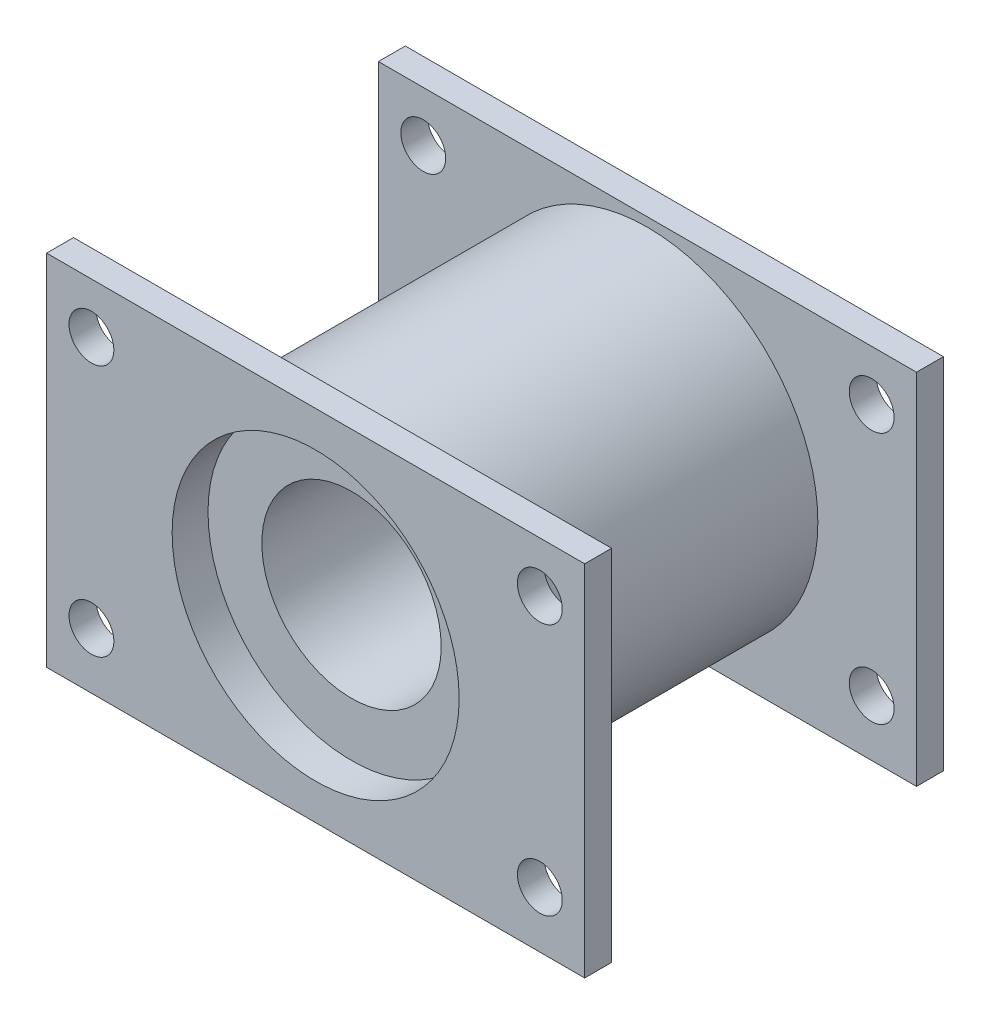
ISO-10303-21;
HEADER;
FILE_DESCRIPTION(('STEP AP214'),'2;1');
FILE_NAME('part.step','',(''),(''),'','','');
FILE_SCHEMA(('AUTOMOTIVE_DESIGN { 1 0 10303 214 1 1 1 1 }'));
ENDSEC;
DATA;
#1=APPLICATION_CONTEXT('core data for automotive mechanical design processes');
#2=APPLICATION_PROTOCOL_DEFINITION('international standard','automotive_design',2000,#1);
#3=PRODUCT_CONTEXT('',#1,'mechanical');
#4=PRODUCT('Part','Part','',(#3));
#5=PRODUCT_RELATED_PRODUCT_CATEGORY('part','',(#4));
#6=PRODUCT_DEFINITION_FORMATION('','',#4);
#7=PRODUCT_DEFINITION_CONTEXT('part definition',#1,'design');
#8=PRODUCT_DEFINITION('design','',#6,#7);
#9=PRODUCT_DEFINITION_SHAPE('','',#8);
#10=(LENGTH_UNIT() NAMED_UNIT(*) SI_UNIT(.MILLI.,.METRE.));
#11=(NAMED_UNIT(*) PLANE_ANGLE_UNIT() SI_UNIT($,.RADIAN.));
#12=(NAMED_UNIT(*) SI_UNIT($,.STERADIAN.) SOLID_ANGLE_UNIT());
#13=UNCERTAINTY_MEASURE_WITH_UNIT(LENGTH_MEASURE(1.E-05),#10,'distance_accuracy_value','');
#14=(GEOMETRIC_REPRESENTATION_CONTEXT(3) GLOBAL_UNCERTAINTY_ASSIGNED_CONTEXT((#13)) GLOBAL_UNIT_ASSIGNED_CONTEXT((#10,
#11,#12)) REPRESENTATION_CONTEXT('',''));
#15=CARTESIAN_POINT('',(0.,0.,0.));
#16=DIRECTION('',(0.,0.,1.));
#17=DIRECTION('',(1.,0.,0.));
#18=AXIS2_PLACEMENT_3D('',#15,#16,#17);
#19=CARTESIAN_POINT('',(0.,0.,40.));
#20=DIRECTION('',(0.,0.,-1.));
#21=DIRECTION('',(-1.,0.,0.));
#22=AXIS2_PLACEMENT_3D('',#19,#20,#21);
#23=CYLINDRICAL_SURFACE('',#22,16.);
#24=CARTESIAN_POINT('',(0.,0.,0.));
#25=DIRECTION('',(0.,0.,1.));
#26=DIRECTION('',(1.,0.,0.));
#27=AXIS2_PLACEMENT_3D('',#24,#25,#26);
#28=CIRCLE('',#27,16.);
#29=CARTESIAN_POINT('',(16.,0.,0.));
#30=VERTEX_POINT('',#29);
#31=EDGE_CURVE('E174',#30,#30,#28,.T.);
#32=ORIENTED_EDGE('',*,*,#31,.F.);
#33=EDGE_LOOP('',(#32));
#34=FACE_BOUND('',#33,.T.);
#35=CARTESIAN_POINT('',(0.,0.,4.));
#36=DIRECTION('',(0.,0.,1.));
#37=DIRECTION('',(1.,0.,0.));
#38=AXIS2_PLACEMENT_3D('',#35,#36,#37);
#39=CIRCLE('',#38,16.);
#40=CARTESIAN_POINT('',(16.,0.,4.));
#41=VERTEX_POINT('',#40);
#42=EDGE_CURVE('E235',#41,#41,#39,.T.);
#43=ORIENTED_EDGE('',*,*,#42,.T.);
#44=EDGE_LOOP('',(#43));
#45=FACE_BOUND('',#44,.T.);
#46=ADVANCED_FACE('F33',(#34,#45),#23,.F.);
#47=CARTESIAN_POINT('',(0.,0.,40.));
#48=DIRECTION('',(0.,0.,-1.));
#49=DIRECTION('',(-1.,0.,0.));
#50=AXIS2_PLACEMENT_3D('',#47,#48,#49);
#51=CYLINDRICAL_SURFACE('',#50,19.);
#52=CARTESIAN_POINT('',(0.,0.,3.));
#53=DIRECTION('',(0.,0.,-1.));
#54=DIRECTION('',(-1.,0.,0.));
#55=AXIS2_PLACEMENT_3D('',#52,#53,#54);
#56=CIRCLE('',#55,19.);
#57=CARTESIAN_POINT('',(-19.,0.,3.));
#58=VERTEX_POINT('',#57);
#59=EDGE_CURVE('E182',#58,#58,#56,.T.);
#60=ORIENTED_EDGE('',*,*,#59,.F.);
#61=EDGE_LOOP('',(#60));
#62=FACE_BOUND('',#61,.T.);
#63=CARTESIAN_POINT('',(0.,0.,37.));
#64=DIRECTION('',(0.,0.,1.));
#65=DIRECTION('',(1.,0.,0.));
#66=AXIS2_PLACEMENT_3D('',#63,#64,#65);
#67=CIRCLE('',#66,19.);
#68=CARTESIAN_POINT('',(19.,0.,37.));
#69=VERTEX_POINT('',#68);
#70=EDGE_CURVE('E42',#69,#69,#67,.T.);
#71=ORIENTED_EDGE('',*,*,#70,.F.);
#72=EDGE_LOOP('',(#71));
#73=FACE_BOUND('',#72,.T.);
#74=ADVANCED_FACE('F35',(#62,#73),#51,.T.);
#75=CARTESIAN_POINT('',(0.,0.,40.));
#76=DIRECTION('',(0.,0.,1.));
#77=DIRECTION('',(1.,0.,0.));
#78=AXIS2_PLACEMENT_3D('',#75,#76,#77);
#79=PLANE('',#78);
#80=CARTESIAN_POINT('',(-25.,14.3862360898535,40.));
#81=DIRECTION('',(0.,0.,-1.));
#82=DIRECTION('',(-1.,0.,0.));
#83=AXIS2_PLACEMENT_3D('',#80,#81,#82);
#84=CIRCLE('',#83,2.5);
#85=CARTESIAN_POINT('',(-27.5,14.3862360898535,40.));
#86=VERTEX_POINT('',#85);
#87=EDGE_CURVE('E217',#86,#86,#84,.T.);
#88=ORIENTED_EDGE('',*,*,#87,.T.);
#89=EDGE_LOOP('',(#88));
#90=FACE_BOUND('',#89,.T.);
#91=CARTESIAN_POINT('',(25.,-13.7396636813205,40.));
#92=DIRECTION('',(0.,0.,-1.));
#93=DIRECTION('',(-1.,0.,0.));
#94=AXIS2_PLACEMENT_3D('',#91,#92,#93);
#95=CIRCLE('',#94,2.5);
#96=CARTESIAN_POINT('',(22.5,-13.7396636813205,40.));
#97=VERTEX_POINT('',#96);
#98=EDGE_CURVE('E223',#97,#97,#95,.T.);
#99=ORIENTED_EDGE('',*,*,#98,.T.);
#100=EDGE_LOOP('',(#99));
#101=FACE_BOUND('',#100,.T.);
#102=CARTESIAN_POINT('',(-25.,-13.7396636813205,40.));
#103=DIRECTION('',(0.,0.,-1.));
#104=DIRECTION('',(-1.,0.,0.));
#105=AXIS2_PLACEMENT_3D('',#102,#103,#104);
#106=CIRCLE('',#105,2.5);
#107=CARTESIAN_POINT('',(-27.5,-13.7396636813205,40.));
#108=VERTEX_POINT('',#107);
#109=EDGE_CURVE('E224',#108,#108,#106,.T.);
#110=ORIENTED_EDGE('',*,*,#109,.T.);
#111=EDGE_LOOP('',(#110));
#112=FACE_BOUND('',#111,.T.);
#113=CARTESIAN_POINT('',(25.,14.3862360898535,40.));
#114=DIRECTION('',(0.,0.,-1.));
#115=DIRECTION('',(-1.,0.,0.));
#116=AXIS2_PLACEMENT_3D('',#113,#114,#115);
#117=CIRCLE('',#116,2.5);
#118=CARTESIAN_POINT('',(22.5,14.3862360898535,40.));
#119=VERTEX_POINT('',#118);
#120=EDGE_CURVE('E193',#119,#119,#117,.T.);
#121=ORIENTED_EDGE('',*,*,#120,.T.);
#122=EDGE_LOOP('',(#121));
#123=FACE_BOUND('',#122,.T.);
#124=CARTESIAN_POINT('',(0.,0.,40.));
#125=DIRECTION('',(0.,0.,1.));
#126=DIRECTION('',(1.,0.,0.));
#127=AXIS2_PLACEMENT_3D('',#124,#125,#126);
#128=CIRCLE('',#127,16.);
#129=CARTESIAN_POINT('',(16.,0.,40.));
#130=VERTEX_POINT('',#129);
#131=EDGE_CURVE('E179',#130,#130,#128,.T.);
#132=ORIENTED_EDGE('',*,*,#131,.F.);
#133=EDGE_LOOP('',(#132));
#134=FACE_BOUND('',#133,.T.);
#135=DIRECTION('',(0.,1.,0.));
#136=VECTOR('',#135,1.);
#137=CARTESIAN_POINT('',(-30.,20.,40.));
#138=LINE('',#137,#136);
#139=CARTESIAN_POINT('',(-30.,-20.,40.));
#140=VERTEX_POINT('',#139);
#141=CARTESIAN_POINT('',(-30.,20.,40.));
#142=VERTEX_POINT('',#141);
#143=EDGE_CURVE('E145',#140,#142,#138,.T.);
#144=ORIENTED_EDGE('',*,*,#143,.F.);
#145=DIRECTION('',(-1.,0.,0.));
#146=VECTOR('',#145,1.);
#147=CARTESIAN_POINT('',(30.,-20.,40.));
#148=LINE('',#147,#146);
#149=CARTESIAN_POINT('',(30.,-20.,40.));
#150=VERTEX_POINT('',#149);
#151=EDGE_CURVE('E125',#150,#140,#148,.T.);
#152=ORIENTED_EDGE('',*,*,#151,.F.);
#153=DIRECTION('',(0.,-1.,0.));
#154=VECTOR('',#153,1.);
#155=CARTESIAN_POINT('',(30.,20.,40.));
#156=LINE('',#155,#154);
#157=CARTESIAN_POINT('',(30.,20.,40.));
#158=VERTEX_POINT('',#157);
#159=EDGE_CURVE('E137',#158,#150,#156,.T.);
#160=ORIENTED_EDGE('',*,*,#159,.F.);
#161=DIRECTION('',(1.,0.,0.));
#162=VECTOR('',#161,1.);
#163=CARTESIAN_POINT('',(30.,20.,40.));
#164=LINE('',#163,#162);
#165=EDGE_CURVE('E135',#142,#158,#164,.T.);
#166=ORIENTED_EDGE('',*,*,#165,.F.);
#167=EDGE_LOOP('',(#144,#152,#160,#166));
#168=FACE_BOUND('',#167,.T.);
#169=ADVANCED_FACE('F266',(#90,#101,#112,#123,#134,#168),#79,.T.);
#170=CARTESIAN_POINT('',(0.,0.,0.));
#171=DIRECTION('',(0.,0.,1.));
#172=DIRECTION('',(1.,0.,0.));
#173=AXIS2_PLACEMENT_3D('',#170,#171,#172);
#174=PLANE('',#173);
#175=CARTESIAN_POINT('',(-25.,14.3862360898535,0.));
#176=DIRECTION('',(0.,0.,-1.));
#177=DIRECTION('',(-1.,0.,0.));
#178=AXIS2_PLACEMENT_3D('',#175,#176,#177);
#179=CIRCLE('',#178,2.5);
#180=CARTESIAN_POINT('',(-27.5,14.3862360898535,0.));
#181=VERTEX_POINT('',#180);
#182=EDGE_CURVE('E227',#181,#181,#179,.T.);
#183=ORIENTED_EDGE('',*,*,#182,.F.);
#184=EDGE_LOOP('',(#183));
#185=FACE_BOUND('',#184,.T.);
#186=CARTESIAN_POINT('',(25.,-13.7396636813205,0.));
#187=DIRECTION('',(0.,0.,-1.));
#188=DIRECTION('',(-1.,0.,0.));
#189=AXIS2_PLACEMENT_3D('',#186,#187,#188);
#190=CIRCLE('',#189,2.5);
#191=CARTESIAN_POINT('',(22.5,-13.7396636813205,0.));
#192=VERTEX_POINT('',#191);
#193=EDGE_CURVE('E220',#192,#192,#190,.T.);
#194=ORIENTED_EDGE('',*,*,#193,.F.);
#195=EDGE_LOOP('',(#194));
#196=FACE_BOUND('',#195,.T.);
#197=CARTESIAN_POINT('',(-25.,-13.7396636813205,0.));
#198=DIRECTION('',(0.,0.,-1.));
#199=DIRECTION('',(-1.,0.,0.));
#200=AXIS2_PLACEMENT_3D('',#197,#198,#199);
#201=CIRCLE('',#200,2.5);
#202=CARTESIAN_POINT('',(-27.5,-13.7396636813205,0.));
#203=VERTEX_POINT('',#202);
#204=EDGE_CURVE('E232',#203,#203,#201,.T.);
#205=ORIENTED_EDGE('',*,*,#204,.F.);
#206=EDGE_LOOP('',(#205));
#207=FACE_BOUND('',#206,.T.);
#208=CARTESIAN_POINT('',(25.,14.3862360898535,0.));
#209=DIRECTION('',(0.,0.,-1.));
#210=DIRECTION('',(-1.,0.,0.));
#211=AXIS2_PLACEMENT_3D('',#208,#209,#210);
#212=CIRCLE('',#211,2.5);
#213=CARTESIAN_POINT('',(22.5,14.3862360898535,0.));
#214=VERTEX_POINT('',#213);
#215=EDGE_CURVE('E214',#214,#214,#212,.T.);
#216=ORIENTED_EDGE('',*,*,#215,.F.);
#217=EDGE_LOOP('',(#216));
#218=FACE_BOUND('',#217,.T.);
#219=ORIENTED_EDGE('',*,*,#31,.T.);
#220=EDGE_LOOP('',(#219));
#221=FACE_BOUND('',#220,.T.);
#222=DIRECTION('',(0.,1.,0.));
#223=VECTOR('',#222,1.);
#224=CARTESIAN_POINT('',(-30.,20.,0.));
#225=LINE('',#224,#223);
#226=CARTESIAN_POINT('',(-30.,-20.,0.));
#227=VERTEX_POINT('',#226);
#228=CARTESIAN_POINT('',(-30.,20.,0.));
#229=VERTEX_POINT('',#228);
#230=EDGE_CURVE('E150',#227,#229,#225,.T.);
#231=ORIENTED_EDGE('',*,*,#230,.T.);
#232=DIRECTION('',(1.,0.,0.));
#233=VECTOR('',#232,1.);
#234=CARTESIAN_POINT('',(30.,20.,0.));
#235=LINE('',#234,#233);
#236=CARTESIAN_POINT('',(30.,20.,0.));
#237=VERTEX_POINT('',#236);
#238=EDGE_CURVE('E166',#229,#237,#235,.T.);
#239=ORIENTED_EDGE('',*,*,#238,.T.);
#240=DIRECTION('',(0.,-1.,0.));
#241=VECTOR('',#240,1.);
#242=CARTESIAN_POINT('',(30.,20.,0.));
#243=LINE('',#242,#241);
#244=CARTESIAN_POINT('',(30.,-20.,0.));
#245=VERTEX_POINT('',#244);
#246=EDGE_CURVE('E169',#237,#245,#243,.T.);
#247=ORIENTED_EDGE('',*,*,#246,.T.);
#248=DIRECTION('',(-1.,0.,0.));
#249=VECTOR('',#248,1.);
#250=CARTESIAN_POINT('',(30.,-20.,0.));
#251=LINE('',#250,#249);
#252=EDGE_CURVE('E158',#245,#227,#251,.T.);
#253=ORIENTED_EDGE('',*,*,#252,.T.);
#254=EDGE_LOOP('',(#231,#239,#247,#253));
#255=FACE_BOUND('',#254,.T.);
#256=ADVANCED_FACE('F274',(#185,#196,#207,#218,#221,#255),#174,.F.);
#257=CARTESIAN_POINT('',(0.,0.,36.));
#258=DIRECTION('',(0.,0.,1.));
#259=DIRECTION('',(1.,0.,0.));
#260=AXIS2_PLACEMENT_3D('',#257,#258,#259);
#261=CIRCLE('',#260,16.);
#262=CARTESIAN_POINT('',(16.,0.,36.));
#263=VERTEX_POINT('',#262);
#264=EDGE_CURVE('E11',#263,#263,#261,.T.);
#265=ORIENTED_EDGE('',*,*,#264,.F.);
#266=EDGE_LOOP('',(#265));
#267=FACE_BOUND('',#266,.T.);
#268=ORIENTED_EDGE('',*,*,#131,.T.);
#269=EDGE_LOOP('',(#268));
#270=FACE_BOUND('',#269,.T.);
#271=ADVANCED_FACE('F262',(#267,#270),#23,.F.);
#272=CARTESIAN_POINT('',(-30.,20.,3.));
#273=DIRECTION('',(-1.,0.,0.));
#274=DIRECTION('',(0.,-1.,0.));
#275=AXIS2_PLACEMENT_3D('',#272,#273,#274);
#276=PLANE('',#275);
#277=ORIENTED_EDGE('',*,*,#230,.F.);
#278=DIRECTION('',(0.,0.,-1.));
#279=VECTOR('',#278,1.);
#280=CARTESIAN_POINT('',(-30.,-20.,3.));
#281=LINE('',#280,#279);
#282=CARTESIAN_POINT('',(-30.,-20.,3.));
#283=VERTEX_POINT('',#282);
#284=EDGE_CURVE('E50',#283,#227,#281,.T.);
#285=ORIENTED_EDGE('',*,*,#284,.F.);
#286=DIRECTION('',(0.,1.,0.));
#287=VECTOR('',#286,1.);
#288=CARTESIAN_POINT('',(-30.,20.,3.));
#289=LINE('',#288,#287);
#290=CARTESIAN_POINT('',(-30.,20.,3.));
#291=VERTEX_POINT('',#290);
#292=EDGE_CURVE('E155',#283,#291,#289,.T.);
#293=ORIENTED_EDGE('',*,*,#292,.T.);
#294=DIRECTION('',(0.,0.,-1.));
#295=VECTOR('',#294,1.);
#296=CARTESIAN_POINT('',(-30.,20.,3.));
#297=LINE('',#296,#295);
#298=EDGE_CURVE('E79',#291,#229,#297,.T.);
#299=ORIENTED_EDGE('',*,*,#298,.T.);
#300=EDGE_LOOP('',(#277,#285,#293,#299));
#301=FACE_BOUND('',#300,.T.);
#302=ADVANCED_FACE('F273',(#301),#276,.T.);
#303=CARTESIAN_POINT('',(30.,-20.,3.));
#304=DIRECTION('',(0.,-1.,0.));
#305=DIRECTION('',(0.,0.,-1.));
#306=AXIS2_PLACEMENT_3D('',#303,#304,#305);
#307=PLANE('',#306);
#308=ORIENTED_EDGE('',*,*,#252,.F.);
#309=DIRECTION('',(0.,0.,-1.));
#310=VECTOR('',#309,1.);
#311=CARTESIAN_POINT('',(30.,-20.,3.));
#312=LINE('',#311,#310);
#313=CARTESIAN_POINT('',(30.,-20.,3.));
#314=VERTEX_POINT('',#313);
#315=EDGE_CURVE('E68',#314,#245,#312,.T.);
#316=ORIENTED_EDGE('',*,*,#315,.F.);
#317=DIRECTION('',(-1.,0.,0.));
#318=VECTOR('',#317,1.);
#319=CARTESIAN_POINT('',(30.,-20.,3.));
#320=LINE('',#319,#318);
#321=EDGE_CURVE('E162',#314,#283,#320,.T.);
#322=ORIENTED_EDGE('',*,*,#321,.T.);
#323=ORIENTED_EDGE('',*,*,#284,.T.);
#324=EDGE_LOOP('',(#308,#316,#322,#323));
#325=FACE_BOUND('',#324,.T.);
#326=ADVANCED_FACE('F280',(#325),#307,.T.);
#327=CARTESIAN_POINT('',(30.,20.,3.));
#328=DIRECTION('',(1.,0.,0.));
#329=DIRECTION('',(0.,1.,0.));
#330=AXIS2_PLACEMENT_3D('',#327,#328,#329);
#331=PLANE('',#330);
#332=ORIENTED_EDGE('',*,*,#246,.F.);
#333=DIRECTION('',(0.,0.,-1.));
#334=VECTOR('',#333,1.);
#335=CARTESIAN_POINT('',(30.,20.,3.));
#336=LINE('',#335,#334);
#337=CARTESIAN_POINT('',(30.,20.,3.));
#338=VERTEX_POINT('',#337);
#339=EDGE_CURVE('E176',#338,#237,#336,.T.);
#340=ORIENTED_EDGE('',*,*,#339,.F.);
#341=DIRECTION('',(0.,-1.,0.));
#342=VECTOR('',#341,1.);
#343=CARTESIAN_POINT('',(30.,20.,3.));
#344=LINE('',#343,#342);
#345=EDGE_CURVE('E160',#338,#314,#344,.T.);
#346=ORIENTED_EDGE('',*,*,#345,.T.);
#347=ORIENTED_EDGE('',*,*,#315,.T.);
#348=EDGE_LOOP('',(#332,#340,#346,#347));
#349=FACE_BOUND('',#348,.T.);
#350=ADVANCED_FACE('F315',(#349),#331,.T.);
#351=CARTESIAN_POINT('',(30.,20.,3.));
#352=DIRECTION('',(0.,1.,0.));
#353=DIRECTION('',(0.,0.,1.));
#354=AXIS2_PLACEMENT_3D('',#351,#352,#353);
#355=PLANE('',#354);
#356=ORIENTED_EDGE('',*,*,#238,.F.);
#357=ORIENTED_EDGE('',*,*,#298,.F.);
#358=DIRECTION('',(1.,0.,0.));
#359=VECTOR('',#358,1.);
#360=CARTESIAN_POINT('',(30.,20.,3.));
#361=LINE('',#360,#359);
#362=EDGE_CURVE('E157',#291,#338,#361,.T.);
#363=ORIENTED_EDGE('',*,*,#362,.T.);
#364=ORIENTED_EDGE('',*,*,#339,.T.);
#365=EDGE_LOOP('',(#356,#357,#363,#364));
#366=FACE_BOUND('',#365,.T.);
#367=ADVANCED_FACE('F311',(#366),#355,.T.);
#368=CARTESIAN_POINT('',(0.,0.,3.));
#369=DIRECTION('',(0.,0.,-1.));
#370=DIRECTION('',(-1.,0.,0.));
#371=AXIS2_PLACEMENT_3D('',#368,#369,#370);
#372=PLANE('',#371);
#373=CARTESIAN_POINT('',(-25.,14.3862360898535,3.));
#374=DIRECTION('',(0.,0.,-1.));
#375=DIRECTION('',(-1.,0.,0.));
#376=AXIS2_PLACEMENT_3D('',#373,#374,#375);
#377=CIRCLE('',#376,2.5);
#378=CARTESIAN_POINT('',(-27.5,14.3862360898535,3.));
#379=VERTEX_POINT('',#378);
#380=EDGE_CURVE('E140',#379,#379,#377,.T.);
#381=ORIENTED_EDGE('',*,*,#380,.T.);
#382=EDGE_LOOP('',(#381));
#383=FACE_BOUND('',#382,.T.);
#384=CARTESIAN_POINT('',(25.,-13.7396636813205,3.));
#385=DIRECTION('',(0.,0.,-1.));
#386=DIRECTION('',(-1.,0.,0.));
#387=AXIS2_PLACEMENT_3D('',#384,#385,#386);
#388=CIRCLE('',#387,2.5);
#389=CARTESIAN_POINT('',(22.5,-13.7396636813205,3.));
#390=VERTEX_POINT('',#389);
#391=EDGE_CURVE('E200',#390,#390,#388,.T.);
#392=ORIENTED_EDGE('',*,*,#391,.T.);
#393=EDGE_LOOP('',(#392));
#394=FACE_BOUND('',#393,.T.);
#395=CARTESIAN_POINT('',(-25.,-13.7396636813205,3.));
#396=DIRECTION('',(0.,0.,-1.));
#397=DIRECTION('',(-1.,0.,0.));
#398=AXIS2_PLACEMENT_3D('',#395,#396,#397);
#399=CIRCLE('',#398,2.5);
#400=CARTESIAN_POINT('',(-27.5,-13.7396636813205,3.));
#401=VERTEX_POINT('',#400);
#402=EDGE_CURVE('E197',#401,#401,#399,.T.);
#403=ORIENTED_EDGE('',*,*,#402,.T.);
#404=EDGE_LOOP('',(#403));
#405=FACE_BOUND('',#404,.T.);
#406=CARTESIAN_POINT('',(25.,14.3862360898535,3.));
#407=DIRECTION('',(0.,0.,-1.));
#408=DIRECTION('',(-1.,0.,0.));
#409=AXIS2_PLACEMENT_3D('',#406,#407,#408);
#410=CIRCLE('',#409,2.5);
#411=CARTESIAN_POINT('',(22.5,14.3862360898535,3.));
#412=VERTEX_POINT('',#411);
#413=EDGE_CURVE('E192',#412,#412,#410,.T.);
#414=ORIENTED_EDGE('',*,*,#413,.T.);
#415=EDGE_LOOP('',(#414));
#416=FACE_BOUND('',#415,.T.);
#417=ORIENTED_EDGE('',*,*,#59,.T.);
#418=EDGE_LOOP('',(#417));
#419=FACE_BOUND('',#418,.T.);
#420=ORIENTED_EDGE('',*,*,#292,.F.);
#421=ORIENTED_EDGE('',*,*,#321,.F.);
#422=ORIENTED_EDGE('',*,*,#345,.F.);
#423=ORIENTED_EDGE('',*,*,#362,.F.);
#424=EDGE_LOOP('',(#420,#421,#422,#423));
#425=FACE_BOUND('',#424,.T.);
#426=ADVANCED_FACE('F308',(#383,#394,#405,#416,#419,#425),#372,.F.);
#427=CARTESIAN_POINT('',(0.,0.,37.));
#428=DIRECTION('',(0.,0.,1.));
#429=DIRECTION('',(-1.,0.,0.));
#430=AXIS2_PLACEMENT_3D('',#427,#428,#429);
#431=PLANE('',#430);
#432=CARTESIAN_POINT('',(-25.,14.3862360898535,37.));
#433=DIRECTION('',(0.,0.,1.));
#434=DIRECTION('',(1.,0.,0.));
#435=AXIS2_PLACEMENT_3D('',#432,#433,#434);
#436=CIRCLE('',#435,2.5);
#437=CARTESIAN_POINT('',(-22.5,14.3862360898535,37.));
#438=VERTEX_POINT('',#437);
#439=EDGE_CURVE('E201',#438,#438,#436,.T.);
#440=ORIENTED_EDGE('',*,*,#439,.T.);
#441=EDGE_LOOP('',(#440));
#442=FACE_BOUND('',#441,.T.);
#443=CARTESIAN_POINT('',(25.,-13.7396636813205,37.));
#444=DIRECTION('',(0.,0.,1.));
#445=DIRECTION('',(1.,0.,0.));
#446=AXIS2_PLACEMENT_3D('',#443,#444,#445);
#447=CIRCLE('',#446,2.5);
#448=CARTESIAN_POINT('',(27.5,-13.7396636813205,37.));
#449=VERTEX_POINT('',#448);
#450=EDGE_CURVE('E198',#449,#449,#447,.T.);
#451=ORIENTED_EDGE('',*,*,#450,.T.);
#452=EDGE_LOOP('',(#451));
#453=FACE_BOUND('',#452,.T.);
#454=CARTESIAN_POINT('',(-25.,-13.7396636813205,37.));
#455=DIRECTION('',(0.,0.,1.));
#456=DIRECTION('',(1.,0.,0.));
#457=AXIS2_PLACEMENT_3D('',#454,#455,#456);
#458=CIRCLE('',#457,2.5);
#459=CARTESIAN_POINT('',(-22.5,-13.7396636813205,37.));
#460=VERTEX_POINT('',#459);
#461=EDGE_CURVE('E194',#460,#460,#458,.T.);
#462=ORIENTED_EDGE('',*,*,#461,.T.);
#463=EDGE_LOOP('',(#462));
#464=FACE_BOUND('',#463,.T.);
#465=CARTESIAN_POINT('',(25.,14.3862360898535,37.));
#466=DIRECTION('',(0.,0.,1.));
#467=DIRECTION('',(1.,0.,0.));
#468=AXIS2_PLACEMENT_3D('',#465,#466,#467);
#469=CIRCLE('',#468,2.5);
#470=CARTESIAN_POINT('',(27.5,14.3862360898535,37.));
#471=VERTEX_POINT('',#470);
#472=EDGE_CURVE('E189',#471,#471,#469,.T.);
#473=ORIENTED_EDGE('',*,*,#472,.T.);
#474=EDGE_LOOP('',(#473));
#475=FACE_BOUND('',#474,.T.);
#476=DIRECTION('',(0.,1.,0.));
#477=VECTOR('',#476,1.);
#478=CARTESIAN_POINT('',(-30.,20.,37.));
#479=LINE('',#478,#477);
#480=CARTESIAN_POINT('',(-30.,-20.,37.));
#481=VERTEX_POINT('',#480);
#482=CARTESIAN_POINT('',(-30.,20.,37.));
#483=VERTEX_POINT('',#482);
#484=EDGE_CURVE('E113',#481,#483,#479,.T.);
#485=ORIENTED_EDGE('',*,*,#484,.T.);
#486=DIRECTION('',(1.,0.,0.));
#487=VECTOR('',#486,1.);
#488=CARTESIAN_POINT('',(30.,20.,37.));
#489=LINE('',#488,#487);
#490=CARTESIAN_POINT('',(30.,20.,37.));
#491=VERTEX_POINT('',#490);
#492=EDGE_CURVE('E130',#483,#491,#489,.T.);
#493=ORIENTED_EDGE('',*,*,#492,.T.);
#494=DIRECTION('',(0.,-1.,0.));
#495=VECTOR('',#494,1.);
#496=CARTESIAN_POINT('',(30.,20.,37.));
#497=LINE('',#496,#495);
#498=CARTESIAN_POINT('',(30.,-20.,37.));
#499=VERTEX_POINT('',#498);
#500=EDGE_CURVE('E116',#491,#499,#497,.T.);
#501=ORIENTED_EDGE('',*,*,#500,.T.);
#502=DIRECTION('',(-1.,0.,0.));
#503=VECTOR('',#502,1.);
#504=CARTESIAN_POINT('',(30.,-20.,37.));
#505=LINE('',#504,#503);
#506=EDGE_CURVE('E108',#499,#481,#505,.T.);
#507=ORIENTED_EDGE('',*,*,#506,.T.);
#508=EDGE_LOOP('',(#485,#493,#501,#507));
#509=FACE_BOUND('',#508,.T.);
#510=ORIENTED_EDGE('',*,*,#70,.T.);
#511=EDGE_LOOP('',(#510));
#512=FACE_BOUND('',#511,.T.);
#513=ADVANCED_FACE('F110',(#442,#453,#464,#475,#509,#512),#431,.F.);
#514=CARTESIAN_POINT('',(-30.,20.,37.));
#515=DIRECTION('',(1.,0.,0.));
#516=DIRECTION('',(0.,1.,0.));
#517=AXIS2_PLACEMENT_3D('',#514,#515,#516);
#518=PLANE('',#517);
#519=ORIENTED_EDGE('',*,*,#143,.T.);
#520=DIRECTION('',(0.,0.,1.));
#521=VECTOR('',#520,1.);
#522=CARTESIAN_POINT('',(-30.,20.,37.));
#523=LINE('',#522,#521);
#524=EDGE_CURVE('E134',#483,#142,#523,.T.);
#525=ORIENTED_EDGE('',*,*,#524,.F.);
#526=ORIENTED_EDGE('',*,*,#484,.F.);
#527=DIRECTION('',(0.,0.,1.));
#528=VECTOR('',#527,1.);
#529=CARTESIAN_POINT('',(-30.,-20.,37.));
#530=LINE('',#529,#528);
#531=EDGE_CURVE('E122',#481,#140,#530,.T.);
#532=ORIENTED_EDGE('',*,*,#531,.T.);
#533=EDGE_LOOP('',(#519,#525,#526,#532));
#534=FACE_BOUND('',#533,.T.);
#535=ADVANCED_FACE('F132',(#534),#518,.F.);
#536=CARTESIAN_POINT('',(30.,20.,37.));
#537=DIRECTION('',(0.,-1.,0.));
#538=DIRECTION('',(0.,0.,-1.));
#539=AXIS2_PLACEMENT_3D('',#536,#537,#538);
#540=PLANE('',#539);
#541=ORIENTED_EDGE('',*,*,#165,.T.);
#542=DIRECTION('',(0.,0.,1.));
#543=VECTOR('',#542,1.);
#544=CARTESIAN_POINT('',(30.,20.,37.));
#545=LINE('',#544,#543);
#546=EDGE_CURVE('E151',#491,#158,#545,.T.);
#547=ORIENTED_EDGE('',*,*,#546,.F.);
#548=ORIENTED_EDGE('',*,*,#492,.F.);
#549=ORIENTED_EDGE('',*,*,#524,.T.);
#550=EDGE_LOOP('',(#541,#547,#548,#549));
#551=FACE_BOUND('',#550,.T.);
#552=ADVANCED_FACE('F292',(#551),#540,.F.);
#553=CARTESIAN_POINT('',(30.,20.,37.));
#554=DIRECTION('',(-1.,0.,0.));
#555=DIRECTION('',(0.,-1.,0.));
#556=AXIS2_PLACEMENT_3D('',#553,#554,#555);
#557=PLANE('',#556);
#558=ORIENTED_EDGE('',*,*,#159,.T.);
#559=DIRECTION('',(0.,0.,1.));
#560=VECTOR('',#559,1.);
#561=CARTESIAN_POINT('',(30.,-20.,37.));
#562=LINE('',#561,#560);
#563=EDGE_CURVE('E129',#499,#150,#562,.T.);
#564=ORIENTED_EDGE('',*,*,#563,.F.);
#565=ORIENTED_EDGE('',*,*,#500,.F.);
#566=ORIENTED_EDGE('',*,*,#546,.T.);
#567=EDGE_LOOP('',(#558,#564,#565,#566));
#568=FACE_BOUND('',#567,.T.);
#569=ADVANCED_FACE('F294',(#568),#557,.F.);
#570=CARTESIAN_POINT('',(30.,-20.,37.));
#571=DIRECTION('',(0.,1.,0.));
#572=DIRECTION('',(0.,0.,1.));
#573=AXIS2_PLACEMENT_3D('',#570,#571,#572);
#574=PLANE('',#573);
#575=ORIENTED_EDGE('',*,*,#151,.T.);
#576=ORIENTED_EDGE('',*,*,#531,.F.);
#577=ORIENTED_EDGE('',*,*,#506,.F.);
#578=ORIENTED_EDGE('',*,*,#563,.T.);
#579=EDGE_LOOP('',(#575,#576,#577,#578));
#580=FACE_BOUND('',#579,.T.);
#581=ADVANCED_FACE('F123',(#580),#574,.F.);
#582=CARTESIAN_POINT('',(25.,14.3862360898535,40.));
#583=DIRECTION('',(0.,0.,-1.));
#584=DIRECTION('',(-1.,0.,0.));
#585=AXIS2_PLACEMENT_3D('',#582,#583,#584);
#586=CYLINDRICAL_SURFACE('',#585,2.5);
#587=ORIENTED_EDGE('',*,*,#120,.F.);
#588=EDGE_LOOP('',(#587));
#589=FACE_BOUND('',#588,.T.);
#590=ORIENTED_EDGE('',*,*,#472,.F.);
#591=EDGE_LOOP('',(#590));
#592=FACE_BOUND('',#591,.T.);
#593=ADVANCED_FACE('F301',(#589,#592),#586,.F.);
#594=CARTESIAN_POINT('',(-25.,-13.7396636813205,40.));
#595=DIRECTION('',(0.,0.,-1.));
#596=DIRECTION('',(-1.,0.,0.));
#597=AXIS2_PLACEMENT_3D('',#594,#595,#596);
#598=CYLINDRICAL_SURFACE('',#597,2.5);
#599=ORIENTED_EDGE('',*,*,#109,.F.);
#600=EDGE_LOOP('',(#599));
#601=FACE_BOUND('',#600,.T.);
#602=ORIENTED_EDGE('',*,*,#461,.F.);
#603=EDGE_LOOP('',(#602));
#604=FACE_BOUND('',#603,.T.);
#605=ADVANCED_FACE('F454',(#601,#604),#598,.F.);
#606=CARTESIAN_POINT('',(25.,-13.7396636813205,40.));
#607=DIRECTION('',(0.,0.,-1.));
#608=DIRECTION('',(-1.,0.,0.));
#609=AXIS2_PLACEMENT_3D('',#606,#607,#608);
#610=CYLINDRICAL_SURFACE('',#609,2.5);
#611=ORIENTED_EDGE('',*,*,#98,.F.);
#612=EDGE_LOOP('',(#611));
#613=FACE_BOUND('',#612,.T.);
#614=ORIENTED_EDGE('',*,*,#450,.F.);
#615=EDGE_LOOP('',(#614));
#616=FACE_BOUND('',#615,.T.);
#617=ADVANCED_FACE('F445',(#613,#616),#610,.F.);
#618=CARTESIAN_POINT('',(-25.,14.3862360898535,40.));
#619=DIRECTION('',(0.,0.,-1.));
#620=DIRECTION('',(-1.,0.,0.));
#621=AXIS2_PLACEMENT_3D('',#618,#619,#620);
#622=CYLINDRICAL_SURFACE('',#621,2.5);
#623=ORIENTED_EDGE('',*,*,#87,.F.);
#624=EDGE_LOOP('',(#623));
#625=FACE_BOUND('',#624,.T.);
#626=ORIENTED_EDGE('',*,*,#439,.F.);
#627=EDGE_LOOP('',(#626));
#628=FACE_BOUND('',#627,.T.);
#629=ADVANCED_FACE('F436',(#625,#628),#622,.F.);
#630=ORIENTED_EDGE('',*,*,#215,.T.);
#631=EDGE_LOOP('',(#630));
#632=FACE_BOUND('',#631,.T.);
#633=ORIENTED_EDGE('',*,*,#413,.F.);
#634=EDGE_LOOP('',(#633));
#635=FACE_BOUND('',#634,.T.);
#636=ADVANCED_FACE('F451',(#632,#635),#586,.F.);
#637=ORIENTED_EDGE('',*,*,#204,.T.);
#638=EDGE_LOOP('',(#637));
#639=FACE_BOUND('',#638,.T.);
#640=ORIENTED_EDGE('',*,*,#402,.F.);
#641=EDGE_LOOP('',(#640));
#642=FACE_BOUND('',#641,.T.);
#643=ADVANCED_FACE('F442',(#639,#642),#598,.F.);
#644=ORIENTED_EDGE('',*,*,#193,.T.);
#645=EDGE_LOOP('',(#644));
#646=FACE_BOUND('',#645,.T.);
#647=ORIENTED_EDGE('',*,*,#391,.F.);
#648=EDGE_LOOP('',(#647));
#649=FACE_BOUND('',#648,.T.);
#650=ADVANCED_FACE('F433',(#646,#649),#610,.F.);
#651=ORIENTED_EDGE('',*,*,#182,.T.);
#652=EDGE_LOOP('',(#651));
#653=FACE_BOUND('',#652,.T.);
#654=ORIENTED_EDGE('',*,*,#380,.F.);
#655=EDGE_LOOP('',(#654));
#656=FACE_BOUND('',#655,.T.);
#657=ADVANCED_FACE('F415',(#653,#656),#622,.F.);
#658=CARTESIAN_POINT('',(0.,0.,4.));
#659=DIRECTION('',(0.,0.,1.));
#660=DIRECTION('',(1.,0.,0.));
#661=AXIS2_PLACEMENT_3D('',#658,#659,#660);
#662=PLANE('',#661);
#663=CARTESIAN_POINT('',(0.,0.,4.));
#664=DIRECTION('',(0.,0.,1.));
#665=DIRECTION('',(1.,0.,0.));
#666=AXIS2_PLACEMENT_3D('',#663,#664,#665);
#667=CIRCLE('',#666,10.);
#668=CARTESIAN_POINT('',(10.,0.,4.));
#669=VERTEX_POINT('',#668);
#670=EDGE_CURVE('E240',#669,#669,#667,.T.);
#671=ORIENTED_EDGE('',*,*,#670,.T.);
#672=EDGE_LOOP('',(#671));
#673=FACE_BOUND('',#672,.T.);
#674=ORIENTED_EDGE('',*,*,#42,.F.);
#675=EDGE_LOOP('',(#674));
#676=FACE_BOUND('',#675,.T.);
#677=ADVANCED_FACE('F256',(#673,#676),#662,.F.);
#678=CARTESIAN_POINT('',(0.,0.,4.));
#679=DIRECTION('',(0.,0.,1.));
#680=DIRECTION('',(1.,0.,0.));
#681=AXIS2_PLACEMENT_3D('',#678,#679,#680);
#682=CYLINDRICAL_SURFACE('',#681,10.);
#683=ORIENTED_EDGE('',*,*,#670,.F.);
#684=EDGE_LOOP('',(#683));
#685=FACE_BOUND('',#684,.T.);
#686=CARTESIAN_POINT('',(0.,0.,36.));
#687=DIRECTION('',(0.,0.,1.));
#688=DIRECTION('',(1.,0.,0.));
#689=AXIS2_PLACEMENT_3D('',#686,#687,#688);
#690=CIRCLE('',#689,10.);
#691=CARTESIAN_POINT('',(10.,0.,36.));
#692=VERTEX_POINT('',#691);
#693=EDGE_CURVE('E243',#692,#692,#690,.T.);
#694=ORIENTED_EDGE('',*,*,#693,.T.);
#695=EDGE_LOOP('',(#694));
#696=FACE_BOUND('',#695,.T.);
#697=ADVANCED_FACE('F247',(#685,#696),#682,.F.);
#698=CARTESIAN_POINT('',(0.,0.,36.));
#699=DIRECTION('',(0.,0.,1.));
#700=DIRECTION('',(1.,0.,0.));
#701=AXIS2_PLACEMENT_3D('',#698,#699,#700);
#702=PLANE('',#701);
#703=ORIENTED_EDGE('',*,*,#264,.T.);
#704=EDGE_LOOP('',(#703));
#705=FACE_BOUND('',#704,.T.);
#706=ORIENTED_EDGE('',*,*,#693,.F.);
#707=EDGE_LOOP('',(#706));
#708=FACE_BOUND('',#707,.T.);
#709=ADVANCED_FACE('F249',(#705,#708),#702,.T.);
#710=CLOSED_SHELL('',(#46,#74,#169,#256,#271,#302,#326,#350,#367,#426,#513,#535,#552,#569,#581,
#593,#605,#617,#629,#636,#643,#650,#657,#677,#697,#709));
#711=MANIFOLD_SOLID_BREP('B2',#710);
#712=ADVANCED_BREP_SHAPE_REPRESENTATION('',(#18,#711),#14);
#713=SHAPE_DEFINITION_REPRESENTATION(#9,#712);
ENDSEC;
END-ISO-10303-21;
